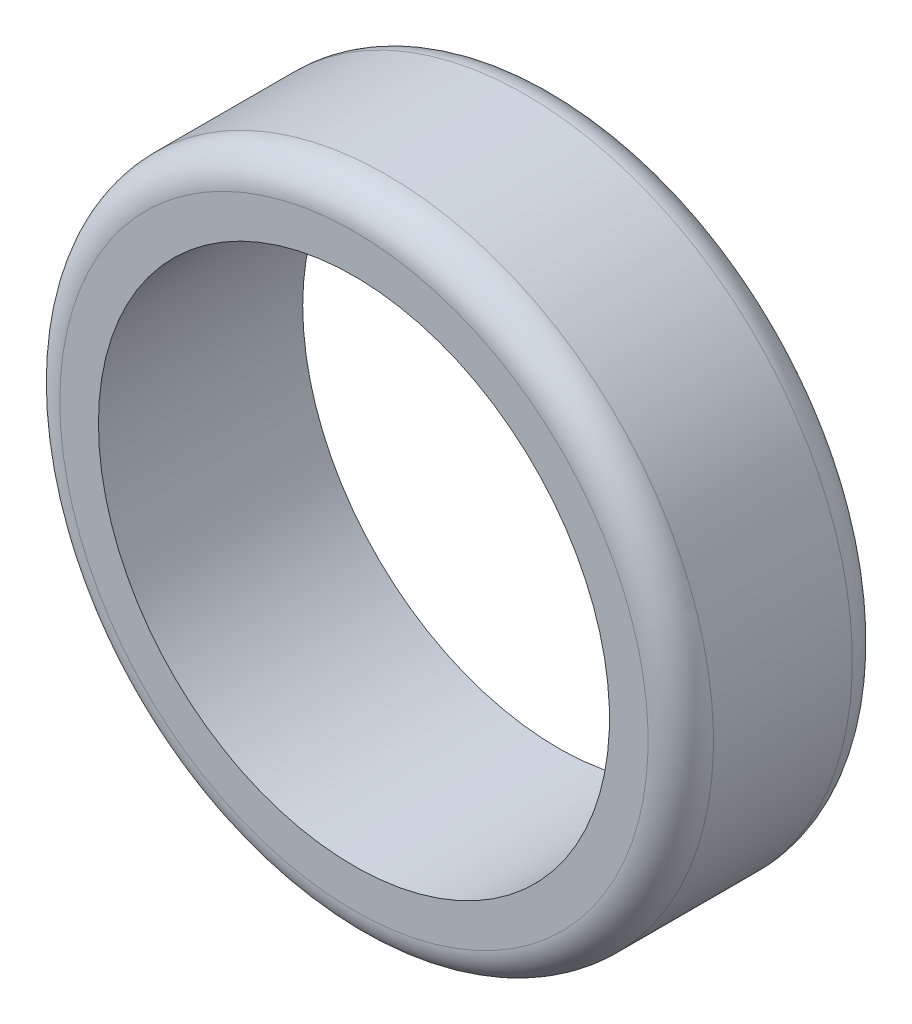
ISO-10303-21;
HEADER;
FILE_DESCRIPTION(('STEP AP214'),'2;1');
FILE_NAME('part.step','',(''),(''),'','','');
FILE_SCHEMA(('AUTOMOTIVE_DESIGN { 1 0 10303 214 1 1 1 1 }'));
ENDSEC;
DATA;
#1=APPLICATION_CONTEXT('core data for automotive mechanical design processes');
#2=APPLICATION_PROTOCOL_DEFINITION('international standard','automotive_design',2000,#1);
#3=PRODUCT_CONTEXT('',#1,'mechanical');
#4=PRODUCT('Part','Part','',(#3));
#5=PRODUCT_RELATED_PRODUCT_CATEGORY('part','',(#4));
#6=PRODUCT_DEFINITION_FORMATION('','',#4);
#7=PRODUCT_DEFINITION_CONTEXT('part definition',#1,'design');
#8=PRODUCT_DEFINITION('design','',#6,#7);
#9=PRODUCT_DEFINITION_SHAPE('','',#8);
#10=(LENGTH_UNIT() NAMED_UNIT(*) SI_UNIT(.MILLI.,.METRE.));
#11=(NAMED_UNIT(*) PLANE_ANGLE_UNIT() SI_UNIT($,.RADIAN.));
#12=(NAMED_UNIT(*) SI_UNIT($,.STERADIAN.) SOLID_ANGLE_UNIT());
#13=UNCERTAINTY_MEASURE_WITH_UNIT(LENGTH_MEASURE(1.E-05),#10,'distance_accuracy_value','');
#14=(GEOMETRIC_REPRESENTATION_CONTEXT(3) GLOBAL_UNCERTAINTY_ASSIGNED_CONTEXT((#13)) GLOBAL_UNIT_ASSIGNED_CONTEXT((#10,
#11,#12)) REPRESENTATION_CONTEXT('',''));
#15=CARTESIAN_POINT('',(0.,0.,0.));
#16=DIRECTION('',(0.,0.,1.));
#17=DIRECTION('',(1.,0.,0.));
#18=AXIS2_PLACEMENT_3D('',#15,#16,#17);
#19=CARTESIAN_POINT('',(38.481,-19.05,-50.8));
#20=DIRECTION('',(0.,0.,-1.));
#21=DIRECTION('',(-1.,0.,0.));
#22=AXIS2_PLACEMENT_3D('',#19,#20,#21);
#23=CYLINDRICAL_SURFACE('',#22,39.71925);
#24=CARTESIAN_POINT('',(38.481,-19.05,15.875));
#25=DIRECTION('',(0.,0.,-1.));
#26=DIRECTION('',(-1.,0.,0.));
#27=AXIS2_PLACEMENT_3D('',#24,#25,#26);
#28=CIRCLE('',#27,39.71925);
#29=CARTESIAN_POINT('',(-1.23825000000001,-19.05,15.875));
#30=VERTEX_POINT('',#29);
#31=EDGE_CURVE('E63',#30,#30,#28,.T.);
#32=ORIENTED_EDGE('',*,*,#31,.F.);
#33=EDGE_LOOP('',(#32));
#34=FACE_BOUND('',#33,.T.);
#35=CARTESIAN_POINT('',(38.481,-19.05,-15.875));
#36=DIRECTION('',(0.,0.,-1.));
#37=DIRECTION('',(-1.,0.,0.));
#38=AXIS2_PLACEMENT_3D('',#35,#36,#37);
#39=CIRCLE('',#38,39.71925);
#40=CARTESIAN_POINT('',(-1.23825000000001,-19.05,-15.875));
#41=VERTEX_POINT('',#40);
#42=EDGE_CURVE('E10',#41,#41,#39,.T.);
#43=ORIENTED_EDGE('',*,*,#42,.T.);
#44=EDGE_LOOP('',(#43));
#45=FACE_BOUND('',#44,.T.);
#46=ADVANCED_FACE('F41',(#34,#45),#23,.F.);
#47=CARTESIAN_POINT('',(78.20025,-19.05,-15.875));
#48=DIRECTION('',(0.,0.,1.));
#49=DIRECTION('',(1.,0.,0.));
#50=AXIS2_PLACEMENT_3D('',#47,#48,#49);
#51=PLANE('',#50);
#52=ORIENTED_EDGE('',*,*,#42,.F.);
#53=EDGE_LOOP('',(#52));
#54=FACE_BOUND('',#53,.T.);
#55=CARTESIAN_POINT('',(38.481,-19.05,-15.875));
#56=DIRECTION('',(0.,0.,-1.));
#57=DIRECTION('',(-1.,0.,0.));
#58=AXIS2_PLACEMENT_3D('',#55,#56,#57);
#59=CIRCLE('',#58,45.72);
#60=CARTESIAN_POINT('',(-7.23900000000001,-19.05,-15.875));
#61=VERTEX_POINT('',#60);
#62=EDGE_CURVE('E47',#61,#61,#59,.T.);
#63=ORIENTED_EDGE('',*,*,#62,.T.);
#64=EDGE_LOOP('',(#63));
#65=FACE_BOUND('',#64,.T.);
#66=ADVANCED_FACE('F70',(#54,#65),#51,.F.);
#67=CARTESIAN_POINT('',(38.481,-19.05,-10.795));
#68=DIRECTION('',(0.,0.,-1.));
#69=DIRECTION('',(-1.,0.,0.));
#70=AXIS2_PLACEMENT_3D('',#67,#68,#69);
#71=TOROIDAL_SURFACE('',#70,45.72,5.07999999999999);
#72=ORIENTED_EDGE('',*,*,#62,.F.);
#73=EDGE_LOOP('',(#72));
#74=FACE_BOUND('',#73,.T.);
#75=CARTESIAN_POINT('',(38.481,-19.05,-10.795));
#76=DIRECTION('',(0.,0.,-1.));
#77=DIRECTION('',(-1.,0.,0.));
#78=AXIS2_PLACEMENT_3D('',#75,#76,#77);
#79=CIRCLE('',#78,50.8);
#80=CARTESIAN_POINT('',(-12.319,-19.05,-10.795));
#81=VERTEX_POINT('',#80);
#82=EDGE_CURVE('E51',#81,#81,#79,.T.);
#83=ORIENTED_EDGE('',*,*,#82,.T.);
#84=EDGE_LOOP('',(#83));
#85=FACE_BOUND('',#84,.T.);
#86=ADVANCED_FACE('F74',(#74,#85),#71,.T.);
#87=CARTESIAN_POINT('',(38.481,-19.05,-50.8));
#88=DIRECTION('',(0.,0.,-1.));
#89=DIRECTION('',(-1.,0.,0.));
#90=AXIS2_PLACEMENT_3D('',#87,#88,#89);
#91=CYLINDRICAL_SURFACE('',#90,50.8);
#92=ORIENTED_EDGE('',*,*,#82,.F.);
#93=EDGE_LOOP('',(#92));
#94=FACE_BOUND('',#93,.T.);
#95=CARTESIAN_POINT('',(38.481,-19.05,10.795));
#96=DIRECTION('',(0.,0.,-1.));
#97=DIRECTION('',(-1.,0.,0.));
#98=AXIS2_PLACEMENT_3D('',#95,#96,#97);
#99=CIRCLE('',#98,50.8);
#100=CARTESIAN_POINT('',(-12.319,-19.05,10.795));
#101=VERTEX_POINT('',#100);
#102=EDGE_CURVE('E55',#101,#101,#99,.T.);
#103=ORIENTED_EDGE('',*,*,#102,.T.);
#104=EDGE_LOOP('',(#103));
#105=FACE_BOUND('',#104,.T.);
#106=ADVANCED_FACE('F79',(#94,#105),#91,.T.);
#107=CARTESIAN_POINT('',(38.481,-19.05,10.795));
#108=DIRECTION('',(0.,0.,-1.));
#109=DIRECTION('',(-1.,0.,0.));
#110=AXIS2_PLACEMENT_3D('',#107,#108,#109);
#111=TOROIDAL_SURFACE('',#110,45.72,5.07999999999999);
#112=ORIENTED_EDGE('',*,*,#102,.F.);
#113=EDGE_LOOP('',(#112));
#114=FACE_BOUND('',#113,.T.);
#115=CARTESIAN_POINT('',(38.481,-19.05,15.875));
#116=DIRECTION('',(0.,0.,-1.));
#117=DIRECTION('',(-1.,0.,0.));
#118=AXIS2_PLACEMENT_3D('',#115,#116,#117);
#119=CIRCLE('',#118,45.72);
#120=CARTESIAN_POINT('',(-7.23900000000001,-19.05,15.875));
#121=VERTEX_POINT('',#120);
#122=EDGE_CURVE('E60',#121,#121,#119,.T.);
#123=ORIENTED_EDGE('',*,*,#122,.T.);
#124=EDGE_LOOP('',(#123));
#125=FACE_BOUND('',#124,.T.);
#126=ADVANCED_FACE('F85',(#114,#125),#111,.T.);
#127=CARTESIAN_POINT('',(84.201,-19.05,15.875));
#128=DIRECTION('',(0.,0.,-1.));
#129=DIRECTION('',(-1.,0.,0.));
#130=AXIS2_PLACEMENT_3D('',#127,#128,#129);
#131=PLANE('',#130);
#132=ORIENTED_EDGE('',*,*,#122,.F.);
#133=EDGE_LOOP('',(#132));
#134=FACE_BOUND('',#133,.T.);
#135=ORIENTED_EDGE('',*,*,#31,.T.);
#136=EDGE_LOOP('',(#135));
#137=FACE_BOUND('',#136,.T.);
#138=ADVANCED_FACE('F67',(#134,#137),#131,.F.);
#139=CLOSED_SHELL('',(#46,#66,#86,#106,#126,#138));
#140=MANIFOLD_SOLID_BREP('B2',#139);
#141=ADVANCED_BREP_SHAPE_REPRESENTATION('',(#18,#140),#14);
#142=SHAPE_DEFINITION_REPRESENTATION(#9,#141);
ENDSEC;
END-ISO-10303-21;
